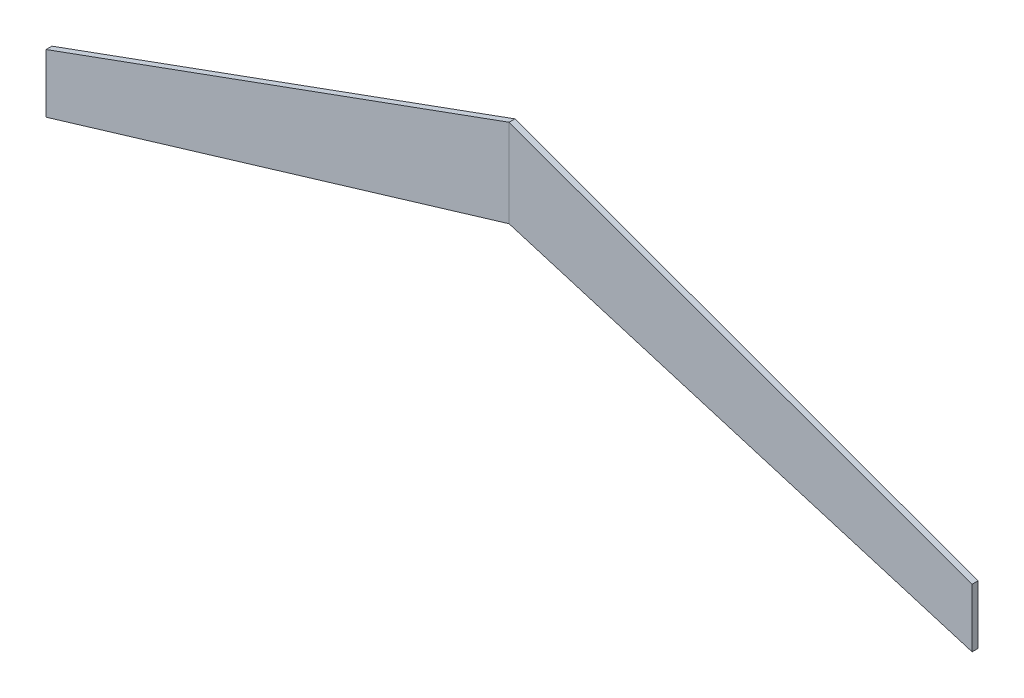
ISO-10303-21;
HEADER;
FILE_DESCRIPTION(('STEP AP214'),'2;1');
FILE_NAME('part.step','',(''),(''),'','','');
FILE_SCHEMA(('AUTOMOTIVE_DESIGN { 1 0 10303 214 1 1 1 1 }'));
ENDSEC;
DATA;
#1=APPLICATION_CONTEXT('core data for automotive mechanical design processes');
#2=APPLICATION_PROTOCOL_DEFINITION('international standard','automotive_design',2000,#1);
#3=PRODUCT_CONTEXT('',#1,'mechanical');
#4=PRODUCT('Part','Part','',(#3));
#5=PRODUCT_RELATED_PRODUCT_CATEGORY('part','',(#4));
#6=PRODUCT_DEFINITION_FORMATION('','',#4);
#7=PRODUCT_DEFINITION_CONTEXT('part definition',#1,'design');
#8=PRODUCT_DEFINITION('design','',#6,#7);
#9=PRODUCT_DEFINITION_SHAPE('','',#8);
#10=(LENGTH_UNIT() NAMED_UNIT(*) SI_UNIT(.MILLI.,.METRE.));
#11=(NAMED_UNIT(*) PLANE_ANGLE_UNIT() SI_UNIT($,.RADIAN.));
#12=(NAMED_UNIT(*) SI_UNIT($,.STERADIAN.) SOLID_ANGLE_UNIT());
#13=UNCERTAINTY_MEASURE_WITH_UNIT(LENGTH_MEASURE(1.E-05),#10,'distance_accuracy_value','');
#14=(GEOMETRIC_REPRESENTATION_CONTEXT(3) GLOBAL_UNCERTAINTY_ASSIGNED_CONTEXT((#13)) GLOBAL_UNIT_ASSIGNED_CONTEXT((#10,
#11,#12)) REPRESENTATION_CONTEXT('',''));
#15=CARTESIAN_POINT('',(0.,0.,0.));
#16=DIRECTION('',(0.,0.,1.));
#17=DIRECTION('',(1.,0.,0.));
#18=AXIS2_PLACEMENT_3D('',#15,#16,#17);
#19=CARTESIAN_POINT('',(-316.,-55.0145940281177,4.));
#20=DIRECTION('',(0.342020143325663,-0.939692620785911,0.));
#21=DIRECTION('',(-0.939692620785911,-0.342020143325663,0.));
#22=AXIS2_PLACEMENT_3D('',#19,#20,#21);
#23=PLANE('',#22);
#24=DIRECTION('',(0.939692620785911,0.342020143325663,0.));
#25=VECTOR('',#24,1.);
#26=CARTESIAN_POINT('',(-316.,-55.0145940281177,0.));
#27=LINE('',#26,#25);
#28=CARTESIAN_POINT('',(-316.,-55.0145940281177,0.));
#29=VERTEX_POINT('',#28);
#30=CARTESIAN_POINT('',(0.,60.,0.));
#31=VERTEX_POINT('',#30);
#32=EDGE_CURVE('E107',#29,#31,#27,.T.);
#33=ORIENTED_EDGE('',*,*,#32,.F.);
#34=DIRECTION('',(0.,0.,-1.));
#35=VECTOR('',#34,1.);
#36=CARTESIAN_POINT('',(-316.,-55.0145940281177,4.));
#37=LINE('',#36,#35);
#38=CARTESIAN_POINT('',(-316.,-55.0145940281177,4.));
#39=VERTEX_POINT('',#38);
#40=EDGE_CURVE('E106',#39,#29,#37,.T.);
#41=ORIENTED_EDGE('',*,*,#40,.F.);
#42=DIRECTION('',(0.939692620785911,0.342020143325663,0.));
#43=VECTOR('',#42,1.);
#44=CARTESIAN_POINT('',(-316.,-55.0145940281177,4.));
#45=LINE('',#44,#43);
#46=CARTESIAN_POINT('',(0.,60.,4.));
#47=VERTEX_POINT('',#46);
#48=EDGE_CURVE('E101',#39,#47,#45,.T.);
#49=ORIENTED_EDGE('',*,*,#48,.T.);
#50=DIRECTION('',(0.,0.,-1.));
#51=VECTOR('',#50,1.);
#52=CARTESIAN_POINT('',(0.,60.,4.));
#53=LINE('',#52,#51);
#54=EDGE_CURVE('E12',#47,#31,#53,.T.);
#55=ORIENTED_EDGE('',*,*,#54,.T.);
#56=EDGE_LOOP('',(#33,#41,#49,#55));
#57=FACE_BOUND('',#56,.T.);
#58=ADVANCED_FACE('F44',(#57),#23,.F.);
#59=CARTESIAN_POINT('',(0.,60.,4.));
#60=DIRECTION('',(-1.,0.,0.));
#61=DIRECTION('',(0.,1.,0.));
#62=AXIS2_PLACEMENT_3D('',#59,#60,#61);
#63=PLANE('',#62);
#64=DIRECTION('',(0.,-1.,0.));
#65=VECTOR('',#64,1.);
#66=CARTESIAN_POINT('',(0.,60.,0.));
#67=LINE('',#66,#65);
#68=CARTESIAN_POINT('',(0.,0.,0.));
#69=VERTEX_POINT('',#68);
#70=EDGE_CURVE('E109',#31,#69,#67,.T.);
#71=ORIENTED_EDGE('',*,*,#70,.F.);
#72=ORIENTED_EDGE('',*,*,#54,.F.);
#73=DIRECTION('',(0.,-1.,0.));
#74=VECTOR('',#73,1.);
#75=CARTESIAN_POINT('',(0.,60.,4.));
#76=LINE('',#75,#74);
#77=CARTESIAN_POINT('',(0.,0.,4.));
#78=VERTEX_POINT('',#77);
#79=EDGE_CURVE('E85',#47,#78,#76,.T.);
#80=ORIENTED_EDGE('',*,*,#79,.T.);
#81=DIRECTION('',(0.,0.,-1.));
#82=VECTOR('',#81,1.);
#83=CARTESIAN_POINT('',(0.,0.,4.));
#84=LINE('',#83,#82);
#85=EDGE_CURVE('E52',#78,#69,#84,.T.);
#86=ORIENTED_EDGE('',*,*,#85,.T.);
#87=EDGE_LOOP('',(#71,#72,#80,#86));
#88=FACE_BOUND('',#87,.T.);
#89=ADVANCED_FACE('F99',(#88),#63,.F.);
#90=CARTESIAN_POINT('',(-316.,-95.0145940281177,4.));
#91=DIRECTION('',(-0.287944465954652,0.957647108556221,0.));
#92=DIRECTION('',(0.957647108556221,0.287944465954652,0.));
#93=AXIS2_PLACEMENT_3D('',#90,#91,#92);
#94=PLANE('',#93);
#95=DIRECTION('',(-0.957647108556221,-0.287944465954652,0.));
#96=VECTOR('',#95,1.);
#97=CARTESIAN_POINT('',(-316.,-95.0145940281177,0.));
#98=LINE('',#97,#96);
#99=CARTESIAN_POINT('',(-316.,-95.0145940281177,0.));
#100=VERTEX_POINT('',#99);
#101=EDGE_CURVE('E95',#69,#100,#98,.T.);
#102=ORIENTED_EDGE('',*,*,#101,.F.);
#103=ORIENTED_EDGE('',*,*,#85,.F.);
#104=DIRECTION('',(-0.957647108556221,-0.287944465954652,0.));
#105=VECTOR('',#104,1.);
#106=CARTESIAN_POINT('',(-316.,-95.0145940281177,4.));
#107=LINE('',#106,#105);
#108=CARTESIAN_POINT('',(-316.,-95.0145940281177,4.));
#109=VERTEX_POINT('',#108);
#110=EDGE_CURVE('E88',#78,#109,#107,.T.);
#111=ORIENTED_EDGE('',*,*,#110,.T.);
#112=DIRECTION('',(0.,0.,-1.));
#113=VECTOR('',#112,1.);
#114=CARTESIAN_POINT('',(-316.,-95.0145940281177,4.));
#115=LINE('',#114,#113);
#116=EDGE_CURVE('E98',#109,#100,#115,.T.);
#117=ORIENTED_EDGE('',*,*,#116,.T.);
#118=EDGE_LOOP('',(#102,#103,#111,#117));
#119=FACE_BOUND('',#118,.T.);
#120=ADVANCED_FACE('F94',(#119),#94,.F.);
#121=CARTESIAN_POINT('',(-316.,-55.0145940281177,4.));
#122=DIRECTION('',(1.,0.,0.));
#123=DIRECTION('',(0.,0.,1.));
#124=AXIS2_PLACEMENT_3D('',#121,#122,#123);
#125=PLANE('',#124);
#126=DIRECTION('',(0.,1.,0.));
#127=VECTOR('',#126,1.);
#128=CARTESIAN_POINT('',(-316.,-55.0145940281177,0.));
#129=LINE('',#128,#127);
#130=EDGE_CURVE('E74',#100,#29,#129,.T.);
#131=ORIENTED_EDGE('',*,*,#130,.F.);
#132=ORIENTED_EDGE('',*,*,#116,.F.);
#133=DIRECTION('',(0.,1.,0.));
#134=VECTOR('',#133,1.);
#135=CARTESIAN_POINT('',(-316.,-55.0145940281177,4.));
#136=LINE('',#135,#134);
#137=EDGE_CURVE('E60',#109,#39,#136,.T.);
#138=ORIENTED_EDGE('',*,*,#137,.T.);
#139=ORIENTED_EDGE('',*,*,#40,.T.);
#140=EDGE_LOOP('',(#131,#132,#138,#139));
#141=FACE_BOUND('',#140,.T.);
#142=ADVANCED_FACE('F118',(#141),#125,.F.);
#143=CARTESIAN_POINT('',(0.,0.,4.));
#144=DIRECTION('',(0.,0.,1.));
#145=DIRECTION('',(-1.,0.,0.));
#146=AXIS2_PLACEMENT_3D('',#143,#144,#145);
#147=PLANE('',#146);
#148=ORIENTED_EDGE('',*,*,#48,.F.);
#149=ORIENTED_EDGE('',*,*,#137,.F.);
#150=ORIENTED_EDGE('',*,*,#110,.F.);
#151=ORIENTED_EDGE('',*,*,#79,.F.);
#152=EDGE_LOOP('',(#148,#149,#150,#151));
#153=FACE_BOUND('',#152,.T.);
#154=ADVANCED_FACE('F90',(#153),#147,.T.);
#155=CARTESIAN_POINT('',(0.,0.,0.));
#156=DIRECTION('',(0.,0.,1.));
#157=DIRECTION('',(-1.,0.,0.));
#158=AXIS2_PLACEMENT_3D('',#155,#156,#157);
#159=PLANE('',#158);
#160=ORIENTED_EDGE('',*,*,#32,.T.);
#161=ORIENTED_EDGE('',*,*,#70,.T.);
#162=ORIENTED_EDGE('',*,*,#101,.T.);
#163=ORIENTED_EDGE('',*,*,#130,.T.);
#164=EDGE_LOOP('',(#160,#161,#162,#163));
#165=FACE_BOUND('',#164,.T.);
#166=ADVANCED_FACE('F114',(#165),#159,.F.);
#167=CLOSED_SHELL('',(#58,#89,#120,#142,#154,#166));
#168=MANIFOLD_SOLID_BREP('B2',#167);
#169=CARTESIAN_POINT('',(316.,-55.0145940281177,4.));
#170=DIRECTION('',(-0.342020143325663,-0.939692620785911,0.));
#171=DIRECTION('',(0.939692620785911,-0.342020143325663,0.));
#172=AXIS2_PLACEMENT_3D('',#169,#170,#171);
#173=PLANE('',#172);
#174=DIRECTION('',(-0.939692620785911,0.342020143325663,0.));
#175=VECTOR('',#174,1.);
#176=CARTESIAN_POINT('',(316.,-55.0145940281177,0.));
#177=LINE('',#176,#175);
#178=CARTESIAN_POINT('',(316.,-55.0145940281177,0.));
#179=VERTEX_POINT('',#178);
#180=CARTESIAN_POINT('',(0.,60.,0.));
#181=VERTEX_POINT('',#180);
#182=EDGE_CURVE('E231',#179,#181,#177,.T.);
#183=ORIENTED_EDGE('',*,*,#182,.T.);
#184=DIRECTION('',(0.,0.,-1.));
#185=VECTOR('',#184,1.);
#186=CARTESIAN_POINT('',(0.,60.,4.));
#187=LINE('',#186,#185);
#188=CARTESIAN_POINT('',(0.,60.,4.));
#189=VERTEX_POINT('',#188);
#190=EDGE_CURVE('E42',#189,#181,#187,.T.);
#191=ORIENTED_EDGE('',*,*,#190,.F.);
#192=DIRECTION('',(-0.939692620785911,0.342020143325663,0.));
#193=VECTOR('',#192,1.);
#194=CARTESIAN_POINT('',(316.,-55.0145940281177,4.));
#195=LINE('',#194,#193);
#196=CARTESIAN_POINT('',(316.,-55.0145940281177,4.));
#197=VERTEX_POINT('',#196);
#198=EDGE_CURVE('E219',#197,#189,#195,.T.);
#199=ORIENTED_EDGE('',*,*,#198,.F.);
#200=DIRECTION('',(0.,0.,-1.));
#201=VECTOR('',#200,1.);
#202=CARTESIAN_POINT('',(316.,-55.0145940281177,4.));
#203=LINE('',#202,#201);
#204=EDGE_CURVE('E227',#197,#179,#203,.T.);
#205=ORIENTED_EDGE('',*,*,#204,.T.);
#206=EDGE_LOOP('',(#183,#191,#199,#205));
#207=FACE_BOUND('',#206,.T.);
#208=ADVANCED_FACE('F168',(#207),#173,.F.);
#209=CARTESIAN_POINT('',(0.,60.,4.));
#210=DIRECTION('',(1.,0.,0.));
#211=DIRECTION('',(0.,1.,0.));
#212=AXIS2_PLACEMENT_3D('',#209,#210,#211);
#213=PLANE('',#212);
#214=DIRECTION('',(0.,-1.,0.));
#215=VECTOR('',#214,1.);
#216=CARTESIAN_POINT('',(0.,60.,0.));
#217=LINE('',#216,#215);
#218=CARTESIAN_POINT('',(0.,0.,0.));
#219=VERTEX_POINT('',#218);
#220=EDGE_CURVE('E223',#181,#219,#217,.T.);
#221=ORIENTED_EDGE('',*,*,#220,.T.);
#222=DIRECTION('',(0.,0.,-1.));
#223=VECTOR('',#222,1.);
#224=CARTESIAN_POINT('',(0.,0.,4.));
#225=LINE('',#224,#223);
#226=CARTESIAN_POINT('',(0.,0.,4.));
#227=VERTEX_POINT('',#226);
#228=EDGE_CURVE('E176',#227,#219,#225,.T.);
#229=ORIENTED_EDGE('',*,*,#228,.F.);
#230=DIRECTION('',(0.,-1.,0.));
#231=VECTOR('',#230,1.);
#232=CARTESIAN_POINT('',(0.,60.,4.));
#233=LINE('',#232,#231);
#234=EDGE_CURVE('E214',#189,#227,#233,.T.);
#235=ORIENTED_EDGE('',*,*,#234,.F.);
#236=ORIENTED_EDGE('',*,*,#190,.T.);
#237=EDGE_LOOP('',(#221,#229,#235,#236));
#238=FACE_BOUND('',#237,.T.);
#239=ADVANCED_FACE('F222',(#238),#213,.F.);
#240=CARTESIAN_POINT('',(316.,-95.0145940281177,4.));
#241=DIRECTION('',(0.287944465954652,0.957647108556221,0.));
#242=DIRECTION('',(-0.957647108556221,0.287944465954652,0.));
#243=AXIS2_PLACEMENT_3D('',#240,#241,#242);
#244=PLANE('',#243);
#245=DIRECTION('',(0.957647108556221,-0.287944465954652,0.));
#246=VECTOR('',#245,1.);
#247=CARTESIAN_POINT('',(316.,-95.0145940281177,0.));
#248=LINE('',#247,#246);
#249=CARTESIAN_POINT('',(316.,-95.0145940281177,0.));
#250=VERTEX_POINT('',#249);
#251=EDGE_CURVE('E201',#219,#250,#248,.T.);
#252=ORIENTED_EDGE('',*,*,#251,.T.);
#253=DIRECTION('',(0.,0.,-1.));
#254=VECTOR('',#253,1.);
#255=CARTESIAN_POINT('',(316.,-95.0145940281177,4.));
#256=LINE('',#255,#254);
#257=CARTESIAN_POINT('',(316.,-95.0145940281177,4.));
#258=VERTEX_POINT('',#257);
#259=EDGE_CURVE('E224',#258,#250,#256,.T.);
#260=ORIENTED_EDGE('',*,*,#259,.F.);
#261=DIRECTION('',(0.957647108556221,-0.287944465954652,0.));
#262=VECTOR('',#261,1.);
#263=CARTESIAN_POINT('',(316.,-95.0145940281177,4.));
#264=LINE('',#263,#262);
#265=EDGE_CURVE('E217',#227,#258,#264,.T.);
#266=ORIENTED_EDGE('',*,*,#265,.F.);
#267=ORIENTED_EDGE('',*,*,#228,.T.);
#268=EDGE_LOOP('',(#252,#260,#266,#267));
#269=FACE_BOUND('',#268,.T.);
#270=ADVANCED_FACE('F225',(#269),#244,.F.);
#271=CARTESIAN_POINT('',(316.,-55.0145940281177,4.));
#272=DIRECTION('',(-1.,0.,0.));
#273=DIRECTION('',(0.,0.,1.));
#274=AXIS2_PLACEMENT_3D('',#271,#272,#273);
#275=PLANE('',#274);
#276=DIRECTION('',(0.,1.,0.));
#277=VECTOR('',#276,1.);
#278=CARTESIAN_POINT('',(316.,-55.0145940281177,0.));
#279=LINE('',#278,#277);
#280=EDGE_CURVE('E207',#250,#179,#279,.T.);
#281=ORIENTED_EDGE('',*,*,#280,.T.);
#282=ORIENTED_EDGE('',*,*,#204,.F.);
#283=DIRECTION('',(0.,1.,0.));
#284=VECTOR('',#283,1.);
#285=CARTESIAN_POINT('',(316.,-55.0145940281177,4.));
#286=LINE('',#285,#284);
#287=EDGE_CURVE('E184',#258,#197,#286,.T.);
#288=ORIENTED_EDGE('',*,*,#287,.F.);
#289=ORIENTED_EDGE('',*,*,#259,.T.);
#290=EDGE_LOOP('',(#281,#282,#288,#289));
#291=FACE_BOUND('',#290,.T.);
#292=ADVANCED_FACE('F238',(#291),#275,.F.);
#293=CARTESIAN_POINT('',(0.,0.,4.));
#294=DIRECTION('',(0.,0.,1.));
#295=DIRECTION('',(1.,0.,0.));
#296=AXIS2_PLACEMENT_3D('',#293,#294,#295);
#297=PLANE('',#296);
#298=ORIENTED_EDGE('',*,*,#198,.T.);
#299=ORIENTED_EDGE('',*,*,#234,.T.);
#300=ORIENTED_EDGE('',*,*,#265,.T.);
#301=ORIENTED_EDGE('',*,*,#287,.T.);
#302=EDGE_LOOP('',(#298,#299,#300,#301));
#303=FACE_BOUND('',#302,.T.);
#304=ADVANCED_FACE('F215',(#303),#297,.T.);
#305=CARTESIAN_POINT('',(0.,0.,0.));
#306=DIRECTION('',(0.,0.,1.));
#307=DIRECTION('',(1.,0.,0.));
#308=AXIS2_PLACEMENT_3D('',#305,#306,#307);
#309=PLANE('',#308);
#310=ORIENTED_EDGE('',*,*,#182,.F.);
#311=ORIENTED_EDGE('',*,*,#280,.F.);
#312=ORIENTED_EDGE('',*,*,#251,.F.);
#313=ORIENTED_EDGE('',*,*,#220,.F.);
#314=EDGE_LOOP('',(#310,#311,#312,#313));
#315=FACE_BOUND('',#314,.T.);
#316=ADVANCED_FACE('F241',(#315),#309,.F.);
#317=CLOSED_SHELL('',(#208,#239,#270,#292,#304,#316));
#318=MANIFOLD_SOLID_BREP('B6_NOT_SHOWN',#317);
#319=ADVANCED_BREP_SHAPE_REPRESENTATION('',(#18,#168,#318),#14);
#320=SHAPE_DEFINITION_REPRESENTATION(#9,#319);
ENDSEC;
END-ISO-10303-21;
